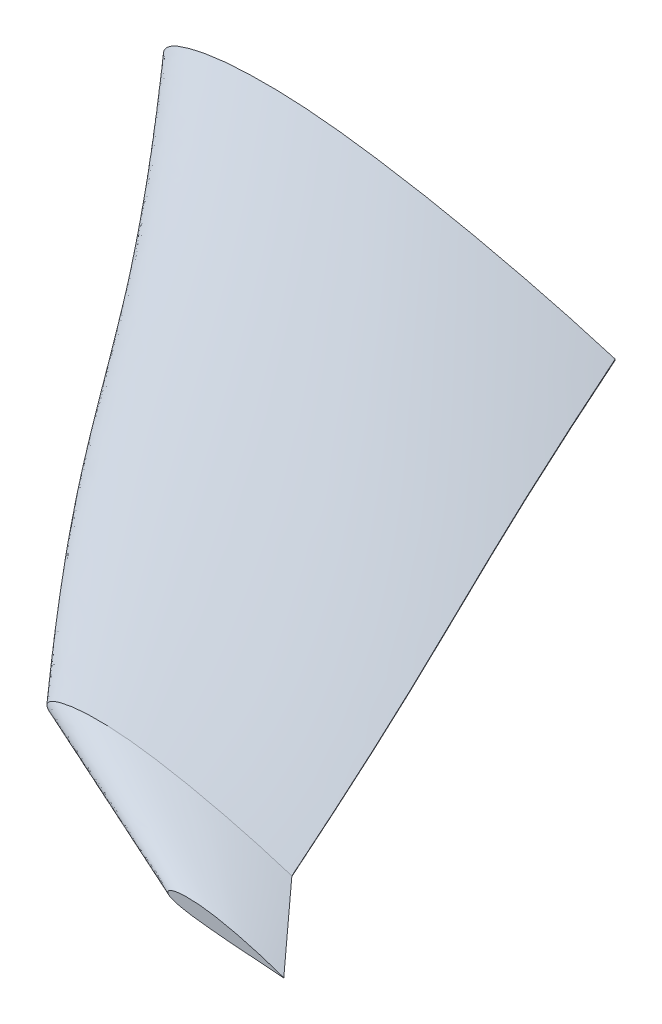
ISO-10303-21;
HEADER;
FILE_DESCRIPTION(('STEP AP214'),'2;1');
FILE_NAME('part.step','',(''),(''),'','','');
FILE_SCHEMA(('AUTOMOTIVE_DESIGN { 1 0 10303 214 1 1 1 1 }'));
ENDSEC;
DATA;
#1=APPLICATION_CONTEXT('core data for automotive mechanical design processes');
#2=APPLICATION_PROTOCOL_DEFINITION('international standard','automotive_design',2000,#1);
#3=PRODUCT_CONTEXT('',#1,'mechanical');
#4=PRODUCT('Part','Part','',(#3));
#5=PRODUCT_RELATED_PRODUCT_CATEGORY('part','',(#4));
#6=PRODUCT_DEFINITION_FORMATION('','',#4);
#7=PRODUCT_DEFINITION_CONTEXT('part definition',#1,'design');
#8=PRODUCT_DEFINITION('design','',#6,#7);
#9=PRODUCT_DEFINITION_SHAPE('','',#8);
#10=(LENGTH_UNIT() NAMED_UNIT(*) SI_UNIT(.MILLI.,.METRE.));
#11=(NAMED_UNIT(*) PLANE_ANGLE_UNIT() SI_UNIT($,.RADIAN.));
#12=(NAMED_UNIT(*) SI_UNIT($,.STERADIAN.) SOLID_ANGLE_UNIT());
#13=UNCERTAINTY_MEASURE_WITH_UNIT(LENGTH_MEASURE(1.E-05),#10,'distance_accuracy_value','');
#14=(GEOMETRIC_REPRESENTATION_CONTEXT(3) GLOBAL_UNCERTAINTY_ASSIGNED_CONTEXT((#13)) GLOBAL_UNIT_ASSIGNED_CONTEXT((#10,
#11,#12)) REPRESENTATION_CONTEXT('',''));
#15=CARTESIAN_POINT('',(0.,0.,0.));
#16=DIRECTION('',(0.,0.,1.));
#17=DIRECTION('',(1.,0.,0.));
#18=AXIS2_PLACEMENT_3D('',#15,#16,#17);
#19=CARTESIAN_POINT('',(0.321211549588751,1.38513605000242,0.));
#20=DIRECTION('',(0.,0.,-1.));
#21=DIRECTION('',(-1.,0.,0.));
#22=AXIS2_PLACEMENT_3D('',#19,#20,#21);
#23=PLANE('',#22);
#24=CARTESIAN_POINT('',(213.493162135836,-18.3985977387796,0.));
#25=CARTESIAN_POINT('',(210.001068508854,-17.358861418454,0.));
#26=CARTESIAN_POINT('',(203.02605295468,-15.2821195606542,0.));
#27=CARTESIAN_POINT('',(189.042387614006,-11.3725974573167,0.));
#28=CARTESIAN_POINT('',(171.520112606889,-6.86338505017849,0.));
#29=CARTESIAN_POINT('',(150.436618758431,-1.93851155160731,0.));
#30=CARTESIAN_POINT('',(129.312241209844,2.47849407440199,0.));
#31=CARTESIAN_POINT('',(108.118882190536,6.21363198308793,0.));
#32=CARTESIAN_POINT('',(86.8776689668776,9.34577660300751,0.));
#33=CARTESIAN_POINT('',(69.0819293463606,11.1183147996094,0.));
#34=CARTESIAN_POINT('',(54.792834861414,11.7745190823262,0.));
#35=CARTESIAN_POINT('',(44.03039723417,11.8458319915289,0.));
#36=CARTESIAN_POINT('',(33.2103727065102,11.4143190106629,0.));
#37=CARTESIAN_POINT('',(24.1576584095502,10.5092531024174,0.));
#38=CARTESIAN_POINT('',(16.891423222456,9.22497315586533,0.));
#39=CARTESIAN_POINT('',(11.3574177018554,7.96357807401569,0.));
#40=CARTESIAN_POINT('',(6.62056207418062,6.34416223062721,0.));
#41=CARTESIAN_POINT('',(2.47282370966279,4.24123989482026,0.));
#42=CARTESIAN_POINT('',(-1.32769035633093,0.309486082961757,0.));
#43=CARTESIAN_POINT('',(1.91001593785473,-3.72198031480986,0.));
#44=CARTESIAN_POINT('',(5.62165750212701,-5.75622948092245,0.));
#45=CARTESIAN_POINT('',(10.0491176639823,-7.44214581087602,0.));
#46=CARTESIAN_POINT('',(15.333006580463,-8.83549991642789,0.));
#47=CARTESIAN_POINT('',(22.3919662078617,-10.2476466023041,0.));
#48=CARTESIAN_POINT('',(31.2362759816886,-11.6329919054533,0.));
#49=CARTESIAN_POINT('',(41.8984815437594,-12.8110098179998,0.));
#50=CARTESIAN_POINT('',(52.5773178664621,-13.7111180719413,0.));
#51=CARTESIAN_POINT('',(66.8373810143671,-14.6421455738428,0.));
#52=CARTESIAN_POINT('',(84.6792224792707,-15.6334614652177,0.));
#53=CARTESIAN_POINT('',(106.113515108805,-16.517367698461,0.));
#54=CARTESIAN_POINT('',(127.567417979444,-17.1058304516163,0.));
#55=CARTESIAN_POINT('',(149.029350711165,-17.6442027773364,0.));
#56=CARTESIAN_POINT('',(170.496353699842,-18.1666577508834,0.));
#57=CARTESIAN_POINT('',(188.389987423759,-18.4835869038475,0.));
#58=CARTESIAN_POINT('',(202.706172144939,-18.7730528543508,0.));
#59=CARTESIAN_POINT('',(209.864963016244,-18.893426097058,0.));
#60=CARTESIAN_POINT('',(213.44460425543,-18.9536168515354,0.));
#61=B_SPLINE_CURVE_WITH_KNOTS('',3,(#24,#25,#26,#27,#28,#29,#30,#31,#32,#33,#34,#35,#36,#37,#38,
#39,#40,#41,#42,#43,#44,#45,#46,#47,#48,#49,#50,#51,#52,#53,#54,#55,#56,#57,#58,#59,#60),
.UNSPECIFIED.,.F.,.F.,(4,1,1,1,1,1,1,1,1,1,1,1,1,1,1,1,1,1,1,1,1,1,1,1,1,1,1,1,1,1,1,1,1,1,4),
(0.,0.025012489715977,0.0499592861627542,0.099672924927269,0.149206319906898,0.198581096612684,
0.247805170454698,0.296916574600785,0.34595272179258,0.370491625538827,0.395091203652992,
0.419814795797951,0.444798575013021,0.457489818920825,0.470406405401129,0.483879408645107,
0.491264120307465,0.50345885330176,0.513609129421187,0.520450990712491,0.533235387638849,
0.545691039129915,0.558031884238607,0.582609167277875,0.607134741746887,0.631652079865866,
0.656174271858889,0.705233949249511,0.754320378529551,0.803437363556193,0.852566095729207,
0.901700994035278,0.950848809338238,0.975422717018713,1.),.UNSPECIFIED.);
#62=CARTESIAN_POINT('',(213.493162135836,-18.3985977387796,0.));
#63=VERTEX_POINT('',#62);
#64=CARTESIAN_POINT('',(213.44460425543,-18.9536168515354,0.));
#65=VERTEX_POINT('',#64);
#66=EDGE_CURVE('E149',#63,#65,#61,.T.);
#67=ORIENTED_EDGE('',*,*,#66,.F.);
#68=DIRECTION('',(0.0871557427475811,0.996194698091752,0.));
#69=VECTOR('',#68,1.);
#70=CARTESIAN_POINT('',(213.493162135836,-18.3985977387796,0.));
#71=LINE('',#70,#69);
#72=EDGE_CURVE('E267',#65,#63,#71,.T.);
#73=ORIENTED_EDGE('',*,*,#72,.F.);
#74=EDGE_LOOP('',(#67,#73));
#75=FACE_BOUND('',#74,.T.);
#76=ADVANCED_FACE('F125',(#75),#23,.T.);
#77=CARTESIAN_POINT('',(213.44460425543,-18.9536168515354,0.));
#78=CARTESIAN_POINT('',(226.862538678686,-19.0972910790039,30.0953693301253));
#79=CARTESIAN_POINT('',(253.162471406783,-20.534168492408,89.5061121705992));
#80=CARTESIAN_POINT('',(295.313473355324,-27.2659662416428,180.74851220358));
#81=CARTESIAN_POINT('',(319.388843848483,-32.8681303766978,240.262627730834));
#82=CARTESIAN_POINT('',(331.160791957332,-36.1551964651623,270.51));
#83=CARTESIAN_POINT('',(213.460790215565,-18.7686104806168,0.));
#84=CARTESIAN_POINT('',(226.876481300607,-18.9233006079934,30.095706429741));
#85=CARTESIAN_POINT('',(253.172638473389,-20.3807560844573,89.506010616325));
#86=CARTESIAN_POINT('',(295.322337157831,-27.1296901721029,180.748369071528));
#87=CARTESIAN_POINT('',(319.398695934074,-32.7549400886849,240.263031574274));
#88=CARTESIAN_POINT('',(331.171339551054,-36.0548428143675,270.51));
#89=CARTESIAN_POINT('',(213.476976175701,-18.5836041096982,0.));
#90=CARTESIAN_POINT('',(226.890423922529,-18.7493101369828,30.0960435293568));
#91=CARTESIAN_POINT('',(253.182805539996,-20.2273436765067,89.5059090620509));
#92=CARTESIAN_POINT('',(295.331200960339,-26.9934141025631,180.748225939476));
#93=CARTESIAN_POINT('',(319.408548019666,-32.6417498006719,240.263435417714));
#94=CARTESIAN_POINT('',(331.181887144777,-35.9544891635727,270.51));
#95=CARTESIAN_POINT('',(213.493162135836,-18.3985977387796,0.));
#96=CARTESIAN_POINT('',(226.90436654445,-18.5753196659723,30.0963806289726));
#97=CARTESIAN_POINT('',(253.192972606603,-20.0739312685561,89.5058075077768));
#98=CARTESIAN_POINT('',(295.340064762847,-26.8571380330232,180.748082807424));
#99=CARTESIAN_POINT('',(319.418400105257,-32.528559512659,240.263839261154));
#100=CARTESIAN_POINT('',(331.1924347385,-35.8541355127779,270.51));
#101=B_SPLINE_SURFACE_WITH_KNOTS('',3,3,((#77,#78,#79,#80,#81,#82),(#83,#84,#85,#86,#87,#88),
(#89,#90,#91,#92,#93,#94),(#95,#96,#97,#98,#99,#100)),.UNSPECIFIED.,.F.,.F.,.F.,(4,4),(4,1,1,4),
(0.,1.),(0.,0.335136084150019,0.666898104022057,1.),.UNSPECIFIED.);
#102=CARTESIAN_POINT('',(213.493162135836,-18.3985977387796,0.));
#103=CARTESIAN_POINT('',(226.90436654445,-18.5753196659723,30.0963806289726));
#104=CARTESIAN_POINT('',(253.192972606603,-20.0739312685561,89.5058075077768));
#105=CARTESIAN_POINT('',(295.340064762847,-26.8571380330232,180.748082807424));
#106=CARTESIAN_POINT('',(319.418400105257,-32.528559512659,240.263839261154));
#107=CARTESIAN_POINT('',(331.1924347385,-35.8541355127779,270.51));
#108=B_SPLINE_CURVE_WITH_KNOTS('',3,(#102,#103,#104,#105,#106,#107),.UNSPECIFIED.,.F.,.F.,(4,1,
1,4),(0.,0.335136084150019,0.666898104022057,1.),.UNSPECIFIED.);
#109=CARTESIAN_POINT('',(331.1924347385,-35.8541355127779,270.51));
#110=VERTEX_POINT('',#109);
#111=EDGE_CURVE('E268',#63,#110,#108,.T.);
#112=DIRECTION('',(0.104528463267411,0.994521895368299,0.));
#113=VECTOR('',#112,1.);
#114=CARTESIAN_POINT('',(331.176613347916,-36.0046659889702,270.51));
#115=LINE('',#114,#113);
#116=CARTESIAN_POINT('',(331.160791957332,-36.1551964651623,270.51));
#117=VERTEX_POINT('',#116);
#118=EDGE_CURVE('E12',#117,#110,#115,.T.);
#119=CARTESIAN_POINT('',(213.44460425543,-18.9536168515354,0.));
#120=CARTESIAN_POINT('',(226.862538678686,-19.0972910790039,30.0953693301253));
#121=CARTESIAN_POINT('',(253.162471406783,-20.534168492408,89.5061121705992));
#122=CARTESIAN_POINT('',(295.313473355324,-27.2659662416428,180.74851220358));
#123=CARTESIAN_POINT('',(319.388843848483,-32.8681303766978,240.262627730834));
#124=CARTESIAN_POINT('',(331.160791957332,-36.1551964651623,270.51));
#125=B_SPLINE_CURVE_WITH_KNOTS('',3,(#119,#120,#121,#122,#123,#124),.UNSPECIFIED.,.F.,.F.,(4,1,
1,4),(0.,0.335136084150019,0.666898104022057,1.),.UNSPECIFIED.);
#126=EDGE_CURVE('E269',#117,#65,#125,.F.);
#127=ORIENTED_EDGE('',*,*,#72,.T.);
#128=ORIENTED_EDGE('',*,*,#111,.T.);
#129=ORIENTED_EDGE('',*,*,#118,.F.);
#130=ORIENTED_EDGE('',*,*,#126,.T.);
#131=EDGE_LOOP('',(#127,#128,#129,#130));
#132=FACE_BOUND('',#131,.T.);
#133=ADVANCED_FACE('F251',(#132),#101,.T.);
#134=CARTESIAN_POINT('',(213.493162135836,-18.3985977387796,0.));
#135=CARTESIAN_POINT('',(226.90436654445,-18.5753196659723,30.0963806289726));
#136=CARTESIAN_POINT('',(253.192972606603,-20.0739312685561,89.5058075077768));
#137=CARTESIAN_POINT('',(295.340064762847,-26.8571380330232,180.748082807424));
#138=CARTESIAN_POINT('',(319.418400105257,-32.528559512659,240.263839261154));
#139=CARTESIAN_POINT('',(331.1924347385,-35.8541355127779,270.51));
#140=CARTESIAN_POINT('',(210.001068508854,-17.358861418454,0.));
#141=CARTESIAN_POINT('',(223.610852826993,-17.6245419807283,30.0889257374059));
#142=CARTESIAN_POINT('',(250.286903716544,-19.273736759654,89.5107908183956));
#143=CARTESIAN_POINT('',(292.753431589681,-26.1484374132369,180.741753968393));
#144=CARTESIAN_POINT('',(317.285406265482,-31.8975890880902,240.275346209023));
#145=CARTESIAN_POINT('',(329.30516857852,-35.2561706694664,270.51));
#146=CARTESIAN_POINT('',(203.02605295468,-15.2821195606542,0.));
#147=CARTESIAN_POINT('',(217.032475537895,-15.7254837504745,30.0740355339388));
#148=CARTESIAN_POINT('',(244.482398489927,-17.6754493876229,89.5207443513734));
#149=CARTESIAN_POINT('',(287.586958824928,-24.7328975181817,180.72911291251));
#150=CARTESIAN_POINT('',(313.02502072071,-30.6373054314367,240.298329882699));
#151=CARTESIAN_POINT('',(325.535593009578,-34.0618114888534,270.51));
#152=CARTESIAN_POINT('',(189.042387614006,-11.3725974573167,0.));
#153=CARTESIAN_POINT('',(203.843352301703,-12.1563403654178,30.0412733162642));
#154=CARTESIAN_POINT('',(232.851442311001,-14.6817435408762,89.5424758077348));
#155=CARTESIAN_POINT('',(277.231195853682,-22.0812953998621,180.701884954814));
#156=CARTESIAN_POINT('',(304.48755508887,-28.2667647791892,240.347639251691));
#157=CARTESIAN_POINT('',(317.975856220827,-31.8053095298486,270.51));
#158=CARTESIAN_POINT('',(171.520112606889,-6.86338505017849,0.));
#159=CARTESIAN_POINT('',(187.315885151254,-8.04938907438476,29.9964292311644));
#160=CARTESIAN_POINT('',(218.286367956484,-11.2534690927014,89.5719925638465));
#161=CARTESIAN_POINT('',(264.258290634244,-19.0445908576241,180.665409228949));
#162=CARTESIAN_POINT('',(293.795187663331,-25.535667060746,240.413425140533));
#163=CARTESIAN_POINT('',(308.499410002367,-29.1894623997146,270.51));
#164=CARTESIAN_POINT('',(150.436618758431,-1.93851155160731,0.));
#165=CARTESIAN_POINT('',(167.426741714797,-3.57703316448807,29.9370577271212));
#166=CARTESIAN_POINT('',(200.773904138899,-7.54376983909616,89.6108273789968));
#167=CARTESIAN_POINT('',(248.65182626925,-15.7580099742789,180.617963337277));
#168=CARTESIAN_POINT('',(280.939245818828,-22.5573447823741,240.498700842052));
#169=CARTESIAN_POINT('',(297.09222653091,-26.3140319856753,270.51));
#170=CARTESIAN_POINT('',(129.312241209844,2.47849407440199,0.));
#171=CARTESIAN_POINT('',(147.496532970222,0.41899755165225,29.8730518667535));
#172=CARTESIAN_POINT('',(183.240548035301,-4.25590537220973,89.6524687463962));
#173=CARTESIAN_POINT('',(233.01848987033,-12.8447144011649,180.567593535598));
#174=CARTESIAN_POINT('',(268.067773789044,-19.8910023396196,240.588954741896));
#175=CARTESIAN_POINT('',(285.658016498096,-23.7141197663109,270.51));
#176=CARTESIAN_POINT('',(108.118882190536,6.21363198308793,0.));
#177=CARTESIAN_POINT('',(127.499961607454,3.77479288246094,29.8048636066008));
#178=CARTESIAN_POINT('',(165.666111803736,-1.53425018937368,89.6965374058752));
#179=CARTESIAN_POINT('',(217.340496132703,-10.4332867444915,180.5149510689));
#180=CARTESIAN_POINT('',(255.16357013174,-17.6427149754222,240.682913264853));
#181=CARTESIAN_POINT('',(274.179865434462,-21.4839869966944,270.51));
#182=CARTESIAN_POINT('',(86.8776689668776,9.34577660300751,0.));
#183=CARTESIAN_POINT('',(107.456423159288,6.5644797315658,29.7333725205199));
#184=CARTESIAN_POINT('',(148.066643745114,0.686960973240248,89.7425244306638));
#185=CARTESIAN_POINT('',(201.63217877431,-8.46556446903327,180.460508540359));
#186=CARTESIAN_POINT('',(242.239355434251,-15.763898360398,240.779808824563));
#187=CARTESIAN_POINT('',(262.669998946524,-19.5809844524857,270.51));
#188=CARTESIAN_POINT('',(69.0819293463606,11.1183147996094,0.));
#189=CARTESIAN_POINT('',(90.6650357634075,8.10177374930704,29.6710613804901));
#190=CARTESIAN_POINT('',(133.340005045048,1.84287812201813,89.7822747976374));
#191=CARTESIAN_POINT('',(188.481911775339,-7.44312443869545,180.414206904946));
#192=CARTESIAN_POINT('',(231.418821039981,-14.7105296043571,240.861786541589));
#193=CARTESIAN_POINT('',(253.019038449246,-18.4492782966341,270.51));
#194=CARTESIAN_POINT('',(54.792834861414,11.7745190823262,0.));
#195=CARTESIAN_POINT('',(77.1847916182926,8.61511699698462,29.6196579795138));
#196=CARTESIAN_POINT('',(121.530479573383,2.13628511524311,89.814772874926));
#197=CARTESIAN_POINT('',(177.933302359554,-7.18645320850219,180.37702973754));
#198=CARTESIAN_POINT('',(222.734568864501,-14.3332116054558,240.927219744428));
#199=CARTESIAN_POINT('',(245.262523058367,-17.9572876188291,270.51));
#200=CARTESIAN_POINT('',(44.03039723417,11.8458319915289,0.));
#201=CARTESIAN_POINT('',(67.0330584923573,8.60410768877151,29.580292144824));
#202=CARTESIAN_POINT('',(112.643925247689,2.00735996551949,89.8395070712488));
#203=CARTESIAN_POINT('',(169.99404906455,-7.30433499479855,180.349091150504));
#204=CARTESIAN_POINT('',(216.195650564881,-14.3072167318631,240.976183625478));
#205=CARTESIAN_POINT('',(239.416363910804,-17.8164890543781,270.51));
#206=CARTESIAN_POINT('',(33.2103727065102,11.4143190106629,0.));
#207=CARTESIAN_POINT('',(56.829048968141,8.11979566661484,29.5400574155923));
#208=CARTESIAN_POINT('',(103.719498942365,1.46148172678184,89.8646082006777));
#209=CARTESIAN_POINT('',(162.01955149694,-7.79318448503557,180.321156736593));
#210=CARTESIAN_POINT('',(209.6236765007,-14.588176112923,241.024891781575));
#211=CARTESIAN_POINT('',(233.534151780844,-17.9483111701696,270.51));
#212=CARTESIAN_POINT('',(24.1576584095502,10.5092531024174,0.));
#213=CARTESIAN_POINT('',(48.2942958766438,7.2028411541841,29.5057794896708));
#214=CARTESIAN_POINT('',(96.262985915454,0.554790632029118,89.8857996175519));
#215=CARTESIAN_POINT('',(155.355712172774,-8.60262525325472,180.298029008797));
#216=CARTESIAN_POINT('',(204.126684148115,-15.1551672601929,241.064944273909));
#217=CARTESIAN_POINT('',(228.607563554266,-18.354155984458,270.51));
#218=CARTESIAN_POINT('',(16.891423222456,9.22497315586533,0.));
#219=CARTESIAN_POINT('',(41.4469382677523,5.94202937962232,29.4777023300717));
#220=CARTESIAN_POINT('',(90.2881035191554,-0.634302074963703,89.9029529414575));
#221=CARTESIAN_POINT('',(150.015683037141,-9.66294446531732,180.279794733232));
#222=CARTESIAN_POINT('',(199.71528622706,-15.9505658378252,241.096223601941));
#223=CARTESIAN_POINT('',(224.647907562784,-18.9829544311337,270.51));
#224=CARTESIAN_POINT('',(11.3574177018554,7.96357807401569,0.));
#225=CARTESIAN_POINT('',(36.2335367533891,4.71524546030791,29.4560334654936));
#226=CARTESIAN_POINT('',(85.7427564382655,-1.77418488115485,89.91609239617));
#227=CARTESIAN_POINT('',(145.953131721756,-10.6790284591987,180.266064945198));
#228=CARTESIAN_POINT('',(196.355953156392,-16.7291359420679,241.119626012165));
#229=CARTESIAN_POINT('',(221.629525065256,-19.6157465769601,270.51));
#230=CARTESIAN_POINT('',(6.62056207418062,6.34416223062721,0.));
#231=CARTESIAN_POINT('',(31.7744803722957,3.15734230621254,29.4369565691629));
#232=CARTESIAN_POINT('',(81.8617361794341,-3.1962077108096,89.9274608738662));
#233=CARTESIAN_POINT('',(142.484535329774,-11.9460449755459,180.254668601984));
#234=CARTESIAN_POINT('',(193.480773903813,-17.7248154995599,241.138741322423));
#235=CARTESIAN_POINT('',(219.040809700408,-20.4505973244493,270.51));
#236=CARTESIAN_POINT('',(2.47282370966279,4.24123989482026,0.));
#237=CARTESIAN_POINT('',(27.874495459809,1.14876589703227,29.4195753624093));
#238=CARTESIAN_POINT('',(78.4754189597392,-5.00779761358148,89.937562706039));
#239=CARTESIAN_POINT('',(139.458619666965,-13.5596260317908,180.245173584661));
#240=CARTESIAN_POINT('',(190.963184305249,-19.0145597172881,241.154245225989));
#241=CARTESIAN_POINT('',(216.767555071202,-21.5537057330466,270.51));
#242=CARTESIAN_POINT('',(-1.32769035633093,0.309486082961757,0.));
#243=CARTESIAN_POINT('',(24.3145031410197,-2.57808233823712,29.4016438225585));
#244=CARTESIAN_POINT('',(75.4075673241917,-8.32574874226183,89.9472586235873));
#245=CARTESIAN_POINT('',(136.71935356865,-16.5138474425661,180.237895059686));
#246=CARTESIAN_POINT('',(188.655875953834,-21.4196292274765,241.164821465056));
#247=CARTESIAN_POINT('',(214.665592348551,-23.6536434467919,270.51));
#248=CARTESIAN_POINT('',(1.91001593785473,-3.72198031480986,0.));
#249=CARTESIAN_POINT('',(27.3978079518463,-6.34747152974142,29.4093895932417));
#250=CARTESIAN_POINT('',(78.1494119311785,-11.6035115395859,89.9406143693721));
#251=CARTESIAN_POINT('',(139.176262898494,-19.4295437388056,180.249557029994));
#252=CARTESIAN_POINT('',(190.618758534834,-23.8751093810544,241.141916625741));
#253=CARTESIAN_POINT('',(216.386289596125,-25.8744926130322,270.51));
#254=CARTESIAN_POINT('',(5.62165750212701,-5.75622948092245,0.));
#255=CARTESIAN_POINT('',(30.9146324857611,-8.23418356472542,29.4208927143013));
#256=CARTESIAN_POINT('',(81.2477123802077,-13.2213297773066,89.9324248411367));
#257=CARTESIAN_POINT('',(141.949479746157,-20.8676467144497,180.26105719412));
#258=CARTESIAN_POINT('',(192.870145446625,-25.1112061297683,241.12042708406));
#259=CARTESIAN_POINT('',(218.38339739238,-27.0148215081227,270.51));
#260=CARTESIAN_POINT('',(10.0491176639823,-7.44214581087602,0.));
#261=CARTESIAN_POINT('',(35.1044639905956,-9.78785540062072,29.4353664739196));
#262=CARTESIAN_POINT('',(84.9307863098754,-14.5386442673172,89.9224928808187));
#263=CARTESIAN_POINT('',(145.245007179098,-22.0379437500139,180.274235369421));
#264=CARTESIAN_POINT('',(195.556286527383,-26.1337414987524,241.096168909065));
#265=CARTESIAN_POINT('',(220.772686162766,-27.972701909687,270.51));
#266=CARTESIAN_POINT('',(15.333006580463,-8.83549991642789,0.));
#267=CARTESIAN_POINT('',(40.1002175443759,-11.0598872759691,29.4532595431332));
#268=CARTESIAN_POINT('',(89.3157522879755,-15.5991541401455,89.9105096346987));
#269=CARTESIAN_POINT('',(149.167401434331,-22.9792285898745,180.28950344187));
#270=CARTESIAN_POINT('',(198.762749440642,-26.9765672034526,241.068382854478));
#271=CARTESIAN_POINT('',(223.630015363557,-28.7797652969144,270.51));
#272=CARTESIAN_POINT('',(22.3919662078617,-10.2476466023041,0.));
#273=CARTESIAN_POINT('',(46.7707609250187,-12.3364516340787,29.4776117209379));
#274=CARTESIAN_POINT('',(95.1662709241655,-16.6443900154296,89.8944126478682));
#275=CARTESIAN_POINT('',(154.399625529484,-23.9060299943752,180.309547713374));
#276=CARTESIAN_POINT('',(203.047206759127,-27.8283595042541,241.032149405377));
#277=CARTESIAN_POINT('',(227.451496803114,-29.6138704503555,270.51));
#278=CARTESIAN_POINT('',(31.2362759816886,-11.6329919054533,0.));
#279=CARTESIAN_POINT('',(55.124978038478,-13.5744889544146,29.5084499454577));
#280=CARTESIAN_POINT('',(102.490372296224,-17.6365106091244,89.8742101056708));
#281=CARTESIAN_POINT('',(160.948068496207,-24.7845970524823,180.334300211232));
#282=CARTESIAN_POINT('',(208.416707148622,-28.6613183198218,240.9876225345));
#283=CARTESIAN_POINT('',(232.24314727314,-30.4503453283669,270.51));
#284=CARTESIAN_POINT('',(41.8984815437594,-12.8110098179998,0.));
#285=CARTESIAN_POINT('',(65.1916496505545,-14.6038700541375,29.5460149251942));
#286=CARTESIAN_POINT('',(111.312242061127,-18.4256580530978,89.8498475728534));
#287=CARTESIAN_POINT('',(168.833144497602,-25.4815707977918,180.363596023885));
#288=CARTESIAN_POINT('',(214.89213577574,-29.3651556693795,240.9352255971));
#289=CARTESIAN_POINT('',(238.024359493074,-31.1914254299729,270.51));
#290=CARTESIAN_POINT('',(52.5773178664621,-13.7111180719413,0.));
#291=CARTESIAN_POINT('',(75.2707204259448,-15.3715239325666,29.5837520427745));
#292=CARTESIAN_POINT('',(120.143936795451,-18.984729816028,89.8255298359253));
#293=CARTESIAN_POINT('',(176.724670056452,-25.9737416344551,180.392483527385));
#294=CARTESIAN_POINT('',(221.379906956311,-29.8993201162571,240.883756498485));
#295=CARTESIAN_POINT('',(243.817241923785,-31.7816851692663,270.51));
#296=CARTESIAN_POINT('',(66.8373810143671,-14.6421455738428,0.));
#297=CARTESIAN_POINT('',(88.7261271860967,-16.1415541609596,29.6341229971317));
#298=CARTESIAN_POINT('',(131.933963232243,-19.5072706674564,89.7932422099169));
#299=CARTESIAN_POINT('',(187.256550115374,-26.4315762486696,180.430447915067));
#300=CARTESIAN_POINT('',(230.046407880194,-30.4471826121611,240.816335481284));
#301=CARTESIAN_POINT('',(251.555379595883,-32.422701869833,270.51));
#302=CARTESIAN_POINT('',(84.6792224792707,-15.6334614652177,0.));
#303=CARTESIAN_POINT('',(105.55635330747,-16.9413717280267,29.6965658501218));
#304=CARTESIAN_POINT('',(146.684778661257,-20.0176615104597,89.7533934543317));
#305=CARTESIAN_POINT('',(200.427797490357,-26.8766497374708,180.47689724223));
#306=CARTESIAN_POINT('',(240.895384043029,-31.0266727072264,240.734077234843));
#307=CARTESIAN_POINT('',(261.238793615968,-33.1304359325921,270.51));
#308=CARTESIAN_POINT('',(106.113515108805,-16.517367698461,0.));
#309=CARTESIAN_POINT('',(125.767185493773,-17.6129438676353,29.7702453127613));
#310=CARTESIAN_POINT('',(164.404351899109,-20.377088036694,89.7067144506551));
#311=CARTESIAN_POINT('',(216.240897992811,-27.1854020589829,180.530524038329));
#312=CARTESIAN_POINT('',(253.9380571495,-31.5353050468004,240.639559118436));
#313=CARTESIAN_POINT('',(272.874872377579,-33.8138844012274,270.51));
#314=CARTESIAN_POINT('',(127.567417979444,-17.1058304516163,0.));
#315=CARTESIAN_POINT('',(145.988257107223,-18.0060545558634,29.8421543453142));
#316=CARTESIAN_POINT('',(182.13909958003,-20.4919609045208,89.6615461213576));
#317=CARTESIAN_POINT('',(232.058400461732,-27.2764558952013,180.58151298313));
#318=CARTESIAN_POINT('',(267.002020265535,-31.8633761492902,240.550216683599));
#319=CARTESIAN_POINT('',(284.524406259651,-34.337015282579,270.51));
#320=CARTESIAN_POINT('',(149.029350711165,-17.6442027773364,0.));
#321=CARTESIAN_POINT('',(166.210204326874,-18.3515241125298,29.9113466015518));
#322=CARTESIAN_POINT('',(199.883794108276,-20.565480309295,89.6184022526645));
#323=CARTESIAN_POINT('',(247.875802046587,-27.330444737563,180.629472737578));
#324=CARTESIAN_POINT('',(280.080241308474,-32.1608891212505,240.466623620057));
#325=CARTESIAN_POINT('',(296.178777461208,-34.8330100270177,270.51));
#326=CARTESIAN_POINT('',(170.496353699842,-18.1666577508834,0.));
#327=CARTESIAN_POINT('',(186.430458146682,-18.6814900915562,29.9771662525519));
#328=CARTESIAN_POINT('',(217.636576880973,-20.6259966818599,89.57770975342));
#329=CARTESIAN_POINT('',(263.691539249276,-27.3724933309515,180.673886377347));
#330=CARTESIAN_POINT('',(293.170801615898,-32.4488520831591,240.389706460419));
#331=CARTESIAN_POINT('',(307.836054085713,-35.3204055408287,270.51));
#332=CARTESIAN_POINT('',(188.389987423759,-18.4835869038475,0.));
#333=CARTESIAN_POINT('',(203.278687446773,-18.8446736410981,30.0287522621906));
#334=CARTESIAN_POINT('',(232.435692083937,-20.5785445417731,89.5462236795797));
#335=CARTESIAN_POINT('',(276.868396085882,-27.3201936472241,180.707285336023));
#336=CARTESIAN_POINT('',(304.089953940662,-32.6166317908149,240.332458364911));
#337=CARTESIAN_POINT('',(317.553999932104,-35.6622612937278,270.51));
#338=CARTESIAN_POINT('',(202.706172144939,-18.7730528543508,0.));
#339=CARTESIAN_POINT('',(216.75573425345,-19.0087418999768,30.0677194613096));
#340=CARTESIAN_POINT('',(244.278602213616,-20.5704262371126,89.5226496946751));
#341=CARTESIAN_POINT('',(287.409090452033,-27.3046231207238,180.731785795453));
#342=CARTESIAN_POINT('',(312.830213832267,-32.7730226317738,240.290782450419));
#343=CARTESIAN_POINT('',(325.328710116088,-35.9552734513258,270.51));
#344=CARTESIAN_POINT('',(209.864963016244,-18.893426097058,0.));
#345=CARTESIAN_POINT('',(223.493449639923,-19.0677733347299,30.0861522852483));
#346=CARTESIAN_POINT('',(250.20104610743,-20.5462549606046,89.5116249309879));
#347=CARTESIAN_POINT('',(292.67855843294,-27.2788524579091,180.742936478958));
#348=CARTESIAN_POINT('',(317.202533758049,-32.8364263437074,240.272013067005));
#349=CARTESIAN_POINT('',(329.216675679051,-36.0885524097148,270.51));
#350=CARTESIAN_POINT('',(213.44460425543,-18.9536168515354,0.));
#351=CARTESIAN_POINT('',(226.862538678686,-19.0972910790039,30.0953693301253));
#352=CARTESIAN_POINT('',(253.162471406782,-20.534168492408,89.5061121705992));
#353=CARTESIAN_POINT('',(295.313473355324,-27.2659662416428,180.74851220358));
#354=CARTESIAN_POINT('',(319.388843848483,-32.8681303766978,240.262627730835));
#355=CARTESIAN_POINT('',(331.160791957332,-36.1551964651623,270.51));
#356=B_SPLINE_SURFACE_WITH_KNOTS('',3,3,((#134,#135,#136,#137,#138,#139),(#140,#141,#142,#143,
#144,#145),(#146,#147,#148,#149,#150,#151),(#152,#153,#154,#155,#156,#157),(#158,#159,#160,#161,
#162,#163),(#164,#165,#166,#167,#168,#169),(#170,#171,#172,#173,#174,#175),(#176,#177,#178,#179,
#180,#181),(#182,#183,#184,#185,#186,#187),(#188,#189,#190,#191,#192,#193),(#194,#195,#196,#197,
#198,#199),(#200,#201,#202,#203,#204,#205),(#206,#207,#208,#209,#210,#211),(#212,#213,#214,#215,
#216,#217),(#218,#219,#220,#221,#222,#223),(#224,#225,#226,#227,#228,#229),(#230,#231,#232,#233,
#234,#235),(#236,#237,#238,#239,#240,#241),(#242,#243,#244,#245,#246,#247),(#248,#249,#250,#251,
#252,#253),(#254,#255,#256,#257,#258,#259),(#260,#261,#262,#263,#264,#265),(#266,#267,#268,#269,
#270,#271),(#272,#273,#274,#275,#276,#277),(#278,#279,#280,#281,#282,#283),(#284,#285,#286,#287,
#288,#289),(#290,#291,#292,#293,#294,#295),(#296,#297,#298,#299,#300,#301),(#302,#303,#304,#305,
#306,#307),(#308,#309,#310,#311,#312,#313),(#314,#315,#316,#317,#318,#319),(#320,#321,#322,#323,
#324,#325),(#326,#327,#328,#329,#330,#331),(#332,#333,#334,#335,#336,#337),(#338,#339,#340,#341,
#342,#343),(#344,#345,#346,#347,#348,#349),(#350,#351,#352,#353,#354,#355)),.UNSPECIFIED.,.F.,
.F.,.F.,(4,1,1,1,1,1,1,1,1,1,1,1,1,1,1,1,1,1,1,1,1,1,1,1,1,1,1,1,1,1,1,1,1,1,4),(4,1,1,4),(0.,
0.025012489715977,0.0499592861627542,0.099672924927269,0.149206319906898,0.198581096612684,
0.247805170454698,0.296916574600785,0.34595272179258,0.370491625538827,0.395091203652992,
0.419814795797951,0.444798575013021,0.457489818920825,0.470406405401129,0.483879408645107,
0.491264120307465,0.50345885330176,0.513609129421187,0.520450990712491,0.533235387638849,
0.545691039129915,0.558031884238607,0.582609167277875,0.607134741746887,0.631652079865867,
0.656174271858889,0.705233949249511,0.754320378529552,0.803437363556193,0.852566095729207,
0.901700994035278,0.950848809338238,0.975422717018713,1.),(0.,0.335136084150019,
0.666898104022057,1.),.UNSPECIFIED.);
#357=CARTESIAN_POINT('',(331.1924347385,-35.8541355127779,270.51));
#358=CARTESIAN_POINT('',(329.30516857852,-35.2561706694664,270.51));
#359=CARTESIAN_POINT('',(325.535593009578,-34.0618114888534,270.51));
#360=CARTESIAN_POINT('',(317.975856220827,-31.8053095298486,270.51));
#361=CARTESIAN_POINT('',(308.499410002367,-29.1894623997146,270.51));
#362=CARTESIAN_POINT('',(297.09222653091,-26.3140319856753,270.51));
#363=CARTESIAN_POINT('',(285.658016498096,-23.7141197663109,270.51));
#364=CARTESIAN_POINT('',(274.179865434462,-21.4839869966944,270.51));
#365=CARTESIAN_POINT('',(262.669998946524,-19.5809844524857,270.51));
#366=CARTESIAN_POINT('',(253.019038449246,-18.4492782966341,270.51));
#367=CARTESIAN_POINT('',(245.262523058367,-17.9572876188291,270.51));
#368=CARTESIAN_POINT('',(239.416363910804,-17.8164890543781,270.51));
#369=CARTESIAN_POINT('',(233.534151780844,-17.9483111701696,270.51));
#370=CARTESIAN_POINT('',(228.607563554266,-18.354155984458,270.51));
#371=CARTESIAN_POINT('',(224.647907562784,-18.9829544311337,270.51));
#372=CARTESIAN_POINT('',(221.629525065256,-19.6157465769601,270.51));
#373=CARTESIAN_POINT('',(219.040809700408,-20.4505973244493,270.51));
#374=CARTESIAN_POINT('',(216.767555071202,-21.5537057330466,270.51));
#375=CARTESIAN_POINT('',(214.665592348551,-23.6536434467919,270.51));
#376=CARTESIAN_POINT('',(216.386289596125,-25.8744926130322,270.51));
#377=CARTESIAN_POINT('',(218.38339739238,-27.0148215081227,270.51));
#378=CARTESIAN_POINT('',(220.772686162766,-27.972701909687,270.51));
#379=CARTESIAN_POINT('',(223.630015363557,-28.7797652969144,270.51));
#380=CARTESIAN_POINT('',(227.451496803114,-29.6138704503555,270.51));
#381=CARTESIAN_POINT('',(232.24314727314,-30.4503453283669,270.51));
#382=CARTESIAN_POINT('',(238.024359493074,-31.1914254299729,270.51));
#383=CARTESIAN_POINT('',(243.817241923785,-31.7816851692663,270.51));
#384=CARTESIAN_POINT('',(251.555379595883,-32.422701869833,270.51));
#385=CARTESIAN_POINT('',(261.238793615968,-33.1304359325921,270.51));
#386=CARTESIAN_POINT('',(272.874872377579,-33.8138844012274,270.51));
#387=CARTESIAN_POINT('',(284.524406259651,-34.337015282579,270.51));
#388=CARTESIAN_POINT('',(296.178777461208,-34.8330100270177,270.51));
#389=CARTESIAN_POINT('',(307.836054085713,-35.3204055408287,270.51));
#390=CARTESIAN_POINT('',(317.553999932104,-35.6622612937278,270.51));
#391=CARTESIAN_POINT('',(325.328710116088,-35.9552734513258,270.51));
#392=CARTESIAN_POINT('',(329.216675679051,-36.0885524097148,270.51));
#393=CARTESIAN_POINT('',(331.160791957332,-36.1551964651623,270.51));
#394=B_SPLINE_CURVE_WITH_KNOTS('',3,(#357,#358,#359,#360,#361,#362,#363,#364,#365,#366,#367,
#368,#369,#370,#371,#372,#373,#374,#375,#376,#377,#378,#379,#380,#381,#382,#383,#384,#385,#386,
#387,#388,#389,#390,#391,#392,#393),.UNSPECIFIED.,.F.,.F.,(4,1,1,1,1,1,1,1,1,1,1,1,1,1,1,1,1,1,
1,1,1,1,1,1,1,1,1,1,1,1,1,1,1,1,4),(0.,0.025012489715977,0.0499592861627542,0.099672924927269,
0.149206319906898,0.198581096612684,0.247805170454698,0.296916574600785,0.34595272179258,
0.370491625538827,0.395091203652992,0.419814795797951,0.444798575013021,0.457489818920825,
0.470406405401129,0.483879408645107,0.491264120307465,0.50345885330176,0.513609129421187,
0.520450990712491,0.533235387638849,0.545691039129915,0.558031884238607,0.582609167277875,
0.607134741746887,0.631652079865867,0.656174271858889,0.705233949249511,0.754320378529552,
0.803437363556193,0.852566095729207,0.901700994035278,0.950848809338238,0.975422717018713,1.),.UNSPECIFIED.);
#395=EDGE_CURVE('E137',#110,#117,#394,.T.);
#396=ORIENTED_EDGE('',*,*,#66,.T.);
#397=ORIENTED_EDGE('',*,*,#126,.F.);
#398=ORIENTED_EDGE('',*,*,#395,.F.);
#399=ORIENTED_EDGE('',*,*,#111,.F.);
#400=EDGE_LOOP('',(#396,#397,#398,#399));
#401=FACE_BOUND('',#400,.T.);
#402=ADVANCED_FACE('F127',(#401),#356,.T.);
#403=CARTESIAN_POINT('',(309.485033406603,-34.5935773084702,307.34));
#404=DIRECTION('',(0.,0.,-1.));
#405=DIRECTION('',(-1.,0.,0.));
#406=AXIS2_PLACEMENT_3D('',#403,#404,#405);
#407=PLANE('',#406);
#408=CARTESIAN_POINT('',(364.214314227244,-42.5798917879055,307.34));
#409=CARTESIAN_POINT('',(363.327438205128,-42.2644316176481,307.34));
#410=CARTESIAN_POINT('',(361.556015468611,-41.6343398076043,307.34));
#411=CARTESIAN_POINT('',(358.001194054443,-40.4366417013237,307.34));
#412=CARTESIAN_POINT('',(353.541546045706,-39.0363830796113,307.34));
#413=CARTESIAN_POINT('',(348.168750218797,-37.4807364119544,307.34));
#414=CARTESIAN_POINT('',(342.778539914125,-36.0555630858725,307.34));
#415=CARTESIAN_POINT('',(337.361313496573,-34.805373858534,307.34));
#416=CARTESIAN_POINT('',(331.923588089907,-33.7101053736361,307.34));
#417=CARTESIAN_POINT('',(327.356386182137,-33.0121908186552,307.34));
#418=CARTESIAN_POINT('',(323.678778815172,-32.6496947899448,307.34));
#419=CARTESIAN_POINT('',(320.9031144009,-32.4857796513193,307.34));
#420=CARTESIAN_POINT('',(318.105794379509,-32.450811219498,307.34));
#421=CARTESIAN_POINT('',(315.758024391942,-32.561911387,307.34));
#422=CARTESIAN_POINT('',(313.8660254048,-32.795000603077,307.34));
#423=CARTESIAN_POINT('',(312.421238171704,-33.0456068535521,307.34));
#424=CARTESIAN_POINT('',(311.177268931585,-33.3993579068801,307.34));
#425=CARTESIAN_POINT('',(310.078750148336,-33.8858153746075,307.34));
#426=CARTESIAN_POINT('',(309.04508534983,-34.8487924764646,307.34));
#427=CARTESIAN_POINT('',(309.825880705523,-35.9326571648725,307.34));
#428=CARTESIAN_POINT('',(310.755951832388,-36.5076626978375,307.34));
#429=CARTESIAN_POINT('',(311.875408561842,-37.0024794091648,307.34));
#430=CARTESIAN_POINT('',(313.219773201302,-37.4333968647306,307.34));
#431=CARTESIAN_POINT('',(315.021838751617,-37.8931630704927,307.34));
#432=CARTESIAN_POINT('',(317.284873698056,-38.3701541104594,307.34));
#433=CARTESIAN_POINT('',(320.019715432381,-38.8182356649113,307.34));
#434=CARTESIAN_POINT('',(322.762605344278,-39.194843462029,307.34));
#435=CARTESIAN_POINT('',(326.429007008643,-39.6278493038139,307.34));
#436=CARTESIAN_POINT('',(331.018665611486,-40.12483766631,307.34));
#437=CARTESIAN_POINT('',(336.536602082341,-40.6426880098265,307.34));
#438=CARTESIAN_POINT('',(342.063592486078,-41.0845812858713,307.34));
#439=CARTESIAN_POINT('',(347.593331797532,-41.5136601755737,307.34));
#440=CARTESIAN_POINT('',(353.12459441305,-41.9387010611664,307.34));
#441=CARTESIAN_POINT('',(357.736733291437,-42.262402949502,307.34));
#442=CARTESIAN_POINT('',(361.426288338813,-42.5306495063708,307.34));
#443=CARTESIAN_POINT('',(363.27157543652,-42.6584975999606,307.34));
#444=CARTESIAN_POINT('',(364.194282344968,-42.722426036535,307.34));
#445=B_SPLINE_CURVE_WITH_KNOTS('',3,(#408,#409,#410,#411,#412,#413,#414,#415,#416,#417,#418,
#419,#420,#421,#422,#423,#424,#425,#426,#427,#428,#429,#430,#431,#432,#433,#434,#435,#436,#437,
#438,#439,#440,#441,#442,#443,#444),.UNSPECIFIED.,.F.,.F.,(4,1,1,1,1,1,1,1,1,1,1,1,1,1,1,1,1,1,
1,1,1,1,1,1,1,1,1,1,1,1,1,1,1,1,4),(0.,0.025012489715977,0.0499592861627542,0.099672924927269,
0.149206319906898,0.198581096612684,0.247805170454698,0.296916574600785,0.34595272179258,
0.370491625538827,0.395091203652992,0.419814795797951,0.444798575013021,0.457489818920825,
0.470406405401129,0.483879408645107,0.491264120307465,0.50345885330176,0.513609129421187,
0.520450990712491,0.533235387638849,0.545691039129915,0.558031884238607,0.582609167277875,
0.607134741746887,0.631652079865866,0.656174271858889,0.705233949249511,0.754320378529551,
0.803437363556193,0.852566095729207,0.901700994035278,0.950848809338238,0.975422717018713,1.),.UNSPECIFIED.);
#446=CARTESIAN_POINT('',(364.214314227244,-42.5798917879055,307.34));
#447=VERTEX_POINT('',#446);
#448=CARTESIAN_POINT('',(364.194282344968,-42.722426036535,307.34));
#449=VERTEX_POINT('',#448);
#450=EDGE_CURVE('E169',#447,#449,#445,.T.);
#451=ORIENTED_EDGE('',*,*,#450,.T.);
#452=DIRECTION('',(0.139173100961149,0.990268068741418,0.));
#453=VECTOR('',#452,1.);
#454=CARTESIAN_POINT('',(364.194282344968,-42.722426036535,307.34));
#455=LINE('',#454,#453);
#456=EDGE_CURVE('E176',#449,#447,#455,.T.);
#457=ORIENTED_EDGE('',*,*,#456,.T.);
#458=EDGE_LOOP('',(#451,#457));
#459=FACE_BOUND('',#458,.T.);
#460=ADVANCED_FACE('F185',(#459),#407,.F.);
#461=CARTESIAN_POINT('',(331.1924347385,-35.8541355127779,270.51));
#462=CARTESIAN_POINT('',(364.214314227244,-42.5798917879055,307.34));
#463=CARTESIAN_POINT('',(329.30516857852,-35.2561706694664,270.51));
#464=CARTESIAN_POINT('',(363.327438205128,-42.2644316176481,307.34));
#465=CARTESIAN_POINT('',(325.535593009578,-34.0618114888534,270.51));
#466=CARTESIAN_POINT('',(361.556015468611,-41.6343398076043,307.34));
#467=CARTESIAN_POINT('',(317.975856220827,-31.8053095298486,270.51));
#468=CARTESIAN_POINT('',(358.001194054443,-40.4366417013237,307.34));
#469=CARTESIAN_POINT('',(308.499410002367,-29.1894623997146,270.51));
#470=CARTESIAN_POINT('',(353.541546045706,-39.0363830796113,307.34));
#471=CARTESIAN_POINT('',(297.09222653091,-26.3140319856753,270.51));
#472=CARTESIAN_POINT('',(348.168750218797,-37.4807364119544,307.34));
#473=CARTESIAN_POINT('',(285.658016498096,-23.7141197663109,270.51));
#474=CARTESIAN_POINT('',(342.778539914125,-36.0555630858725,307.34));
#475=CARTESIAN_POINT('',(274.179865434462,-21.4839869966944,270.51));
#476=CARTESIAN_POINT('',(337.361313496573,-34.805373858534,307.34));
#477=CARTESIAN_POINT('',(262.669998946524,-19.5809844524857,270.51));
#478=CARTESIAN_POINT('',(331.923588089907,-33.7101053736361,307.34));
#479=CARTESIAN_POINT('',(253.019038449246,-18.4492782966341,270.51));
#480=CARTESIAN_POINT('',(327.356386182137,-33.0121908186552,307.34));
#481=CARTESIAN_POINT('',(245.262523058367,-17.9572876188291,270.51));
#482=CARTESIAN_POINT('',(323.678778815172,-32.6496947899448,307.34));
#483=CARTESIAN_POINT('',(239.416363910804,-17.8164890543781,270.51));
#484=CARTESIAN_POINT('',(320.9031144009,-32.4857796513193,307.34));
#485=CARTESIAN_POINT('',(233.534151780844,-17.9483111701696,270.51));
#486=CARTESIAN_POINT('',(318.105794379509,-32.450811219498,307.34));
#487=CARTESIAN_POINT('',(228.607563554266,-18.354155984458,270.51));
#488=CARTESIAN_POINT('',(315.758024391942,-32.561911387,307.34));
#489=CARTESIAN_POINT('',(224.647907562784,-18.9829544311337,270.51));
#490=CARTESIAN_POINT('',(313.8660254048,-32.795000603077,307.34));
#491=CARTESIAN_POINT('',(221.629525065256,-19.6157465769601,270.51));
#492=CARTESIAN_POINT('',(312.421238171704,-33.0456068535521,307.34));
#493=CARTESIAN_POINT('',(219.040809700408,-20.4505973244493,270.51));
#494=CARTESIAN_POINT('',(311.177268931585,-33.3993579068801,307.34));
#495=CARTESIAN_POINT('',(216.767555071202,-21.5537057330466,270.51));
#496=CARTESIAN_POINT('',(310.078750148336,-33.8858153746075,307.34));
#497=CARTESIAN_POINT('',(214.665592348551,-23.6536434467919,270.51));
#498=CARTESIAN_POINT('',(309.04508534983,-34.8487924764646,307.34));
#499=CARTESIAN_POINT('',(216.386289596125,-25.8744926130322,270.51));
#500=CARTESIAN_POINT('',(309.825880705523,-35.9326571648725,307.34));
#501=CARTESIAN_POINT('',(218.38339739238,-27.0148215081227,270.51));
#502=CARTESIAN_POINT('',(310.755951832388,-36.5076626978375,307.34));
#503=CARTESIAN_POINT('',(220.772686162766,-27.972701909687,270.51));
#504=CARTESIAN_POINT('',(311.875408561842,-37.0024794091648,307.34));
#505=CARTESIAN_POINT('',(223.630015363557,-28.7797652969144,270.51));
#506=CARTESIAN_POINT('',(313.219773201302,-37.4333968647306,307.34));
#507=CARTESIAN_POINT('',(227.451496803114,-29.6138704503555,270.51));
#508=CARTESIAN_POINT('',(315.021838751617,-37.8931630704927,307.34));
#509=CARTESIAN_POINT('',(232.24314727314,-30.4503453283669,270.51));
#510=CARTESIAN_POINT('',(317.284873698056,-38.3701541104594,307.34));
#511=CARTESIAN_POINT('',(238.024359493074,-31.1914254299729,270.51));
#512=CARTESIAN_POINT('',(320.019715432381,-38.8182356649113,307.34));
#513=CARTESIAN_POINT('',(243.817241923785,-31.7816851692663,270.51));
#514=CARTESIAN_POINT('',(322.762605344278,-39.194843462029,307.34));
#515=CARTESIAN_POINT('',(251.555379595883,-32.422701869833,270.51));
#516=CARTESIAN_POINT('',(326.429007008643,-39.6278493038139,307.34));
#517=CARTESIAN_POINT('',(261.238793615968,-33.1304359325921,270.51));
#518=CARTESIAN_POINT('',(331.018665611486,-40.12483766631,307.34));
#519=CARTESIAN_POINT('',(272.874872377579,-33.8138844012274,270.51));
#520=CARTESIAN_POINT('',(336.536602082341,-40.6426880098265,307.34));
#521=CARTESIAN_POINT('',(284.524406259651,-34.337015282579,270.51));
#522=CARTESIAN_POINT('',(342.063592486078,-41.0845812858713,307.34));
#523=CARTESIAN_POINT('',(296.178777461208,-34.8330100270177,270.51));
#524=CARTESIAN_POINT('',(347.593331797532,-41.5136601755737,307.34));
#525=CARTESIAN_POINT('',(307.836054085713,-35.3204055408287,270.51));
#526=CARTESIAN_POINT('',(353.12459441305,-41.9387010611664,307.34));
#527=CARTESIAN_POINT('',(317.553999932104,-35.6622612937278,270.51));
#528=CARTESIAN_POINT('',(357.736733291437,-42.262402949502,307.34));
#529=CARTESIAN_POINT('',(325.328710116088,-35.9552734513258,270.51));
#530=CARTESIAN_POINT('',(361.426288338813,-42.5306495063708,307.34));
#531=CARTESIAN_POINT('',(329.216675679051,-36.0885524097148,270.51));
#532=CARTESIAN_POINT('',(363.27157543652,-42.6584975999606,307.34));
#533=CARTESIAN_POINT('',(331.160791957332,-36.1551964651623,270.51));
#534=CARTESIAN_POINT('',(364.194282344968,-42.722426036535,307.34));
#535=B_SPLINE_SURFACE_WITH_KNOTS('',3,1,((#461,#462),(#463,#464),(#465,#466),(#467,#468),(#469,
#470),(#471,#472),(#473,#474),(#475,#476),(#477,#478),(#479,#480),(#481,#482),(#483,#484),(#485,
#486),(#487,#488),(#489,#490),(#491,#492),(#493,#494),(#495,#496),(#497,#498),(#499,#500),(#501,
#502),(#503,#504),(#505,#506),(#507,#508),(#509,#510),(#511,#512),(#513,#514),(#515,#516),(#517,
#518),(#519,#520),(#521,#522),(#523,#524),(#525,#526),(#527,#528),(#529,#530),(#531,#532),(#533,
#534)),.UNSPECIFIED.,.F.,.F.,.F.,(4,1,1,1,1,1,1,1,1,1,1,1,1,1,1,1,1,1,1,1,1,1,1,1,1,1,1,1,1,1,1,
1,1,1,4),(2,2),(0.,0.025012489715977,0.0499592861627542,0.099672924927269,0.149206319906898,
0.198581096612684,0.247805170454698,0.296916574600785,0.34595272179258,0.370491625538827,
0.395091203652992,0.419814795797951,0.444798575013021,0.457489818920825,0.470406405401129,
0.483879408645107,0.491264120307465,0.50345885330176,0.513609129421187,0.520450990712491,
0.533235387638849,0.545691039129915,0.558031884238607,0.582609167277875,0.607134741746887,
0.631652079865867,0.656174271858889,0.705233949249511,0.754320378529552,0.803437363556193,
0.852566095729207,0.901700994035278,0.950848809338238,0.975422717018713,1.),(0.,1.),.UNSPECIFIED.);
#536=DIRECTION('',(0.66189028163057,-0.131587227977439,0.737960741852992));
#537=VECTOR('',#536,1.);
#538=CARTESIAN_POINT('',(347.67753715115,-39.4388112508487,288.925));
#539=LINE('',#538,#537);
#540=EDGE_CURVE('E164',#117,#449,#539,.T.);
#541=DIRECTION('',(-0.661479682517588,0.134727374529925,-0.737762268057064));
#542=VECTOR('',#541,1.);
#543=CARTESIAN_POINT('',(347.703374482872,-39.2170136503417,288.925));
#544=LINE('',#543,#542);
#545=EDGE_CURVE('E174',#447,#110,#544,.T.);
#546=ORIENTED_EDGE('',*,*,#395,.T.);
#547=ORIENTED_EDGE('',*,*,#540,.T.);
#548=ORIENTED_EDGE('',*,*,#450,.F.);
#549=ORIENTED_EDGE('',*,*,#545,.T.);
#550=EDGE_LOOP('',(#546,#547,#548,#549));
#551=FACE_BOUND('',#550,.T.);
#552=ADVANCED_FACE('F166',(#551),#535,.T.);
#553=CARTESIAN_POINT('',(331.160791957332,-36.1551964651623,270.51));
#554=CARTESIAN_POINT('',(364.194282344968,-42.722426036535,307.34));
#555=CARTESIAN_POINT('',(331.166065754193,-36.105019639765,270.51));
#556=CARTESIAN_POINT('',(364.197620992014,-42.6986703284301,307.34));
#557=CARTESIAN_POINT('',(331.171339551054,-36.0548428143676,270.51));
#558=CARTESIAN_POINT('',(364.20095963906,-42.6749146203251,307.34));
#559=CARTESIAN_POINT('',(331.181887144777,-35.9544891635728,270.51));
#560=CARTESIAN_POINT('',(364.207636933152,-42.6274032041153,307.34));
#561=CARTESIAN_POINT('',(331.187160941639,-35.9043123381754,270.51));
#562=CARTESIAN_POINT('',(364.210975580198,-42.6036474960104,307.34));
#563=CARTESIAN_POINT('',(331.1924347385,-35.8541355127779,270.51));
#564=CARTESIAN_POINT('',(364.214314227244,-42.5798917879055,307.34));
#565=B_SPLINE_SURFACE_WITH_KNOTS('',3,1,((#553,#554),(#555,#556),(#557,#558),(#559,#560),(#561,
#562),(#563,#564)),.UNSPECIFIED.,.F.,.F.,.F.,(4,2,4),(2,2),(0.,0.5,1.),(0.,1.),.UNSPECIFIED.);
#566=ORIENTED_EDGE('',*,*,#118,.T.);
#567=ORIENTED_EDGE('',*,*,#545,.F.);
#568=ORIENTED_EDGE('',*,*,#456,.F.);
#569=ORIENTED_EDGE('',*,*,#540,.F.);
#570=EDGE_LOOP('',(#566,#567,#568,#569));
#571=FACE_BOUND('',#570,.T.);
#572=ADVANCED_FACE('F178',(#571),#565,.T.);
#573=CLOSED_SHELL('',(#76,#133,#402,#460,#552,#572));
#574=MANIFOLD_SOLID_BREP('B2',#573);
#575=ADVANCED_BREP_SHAPE_REPRESENTATION('',(#18,#574),#14);
#576=SHAPE_DEFINITION_REPRESENTATION(#9,#575);
ENDSEC;
END-ISO-10303-21;
